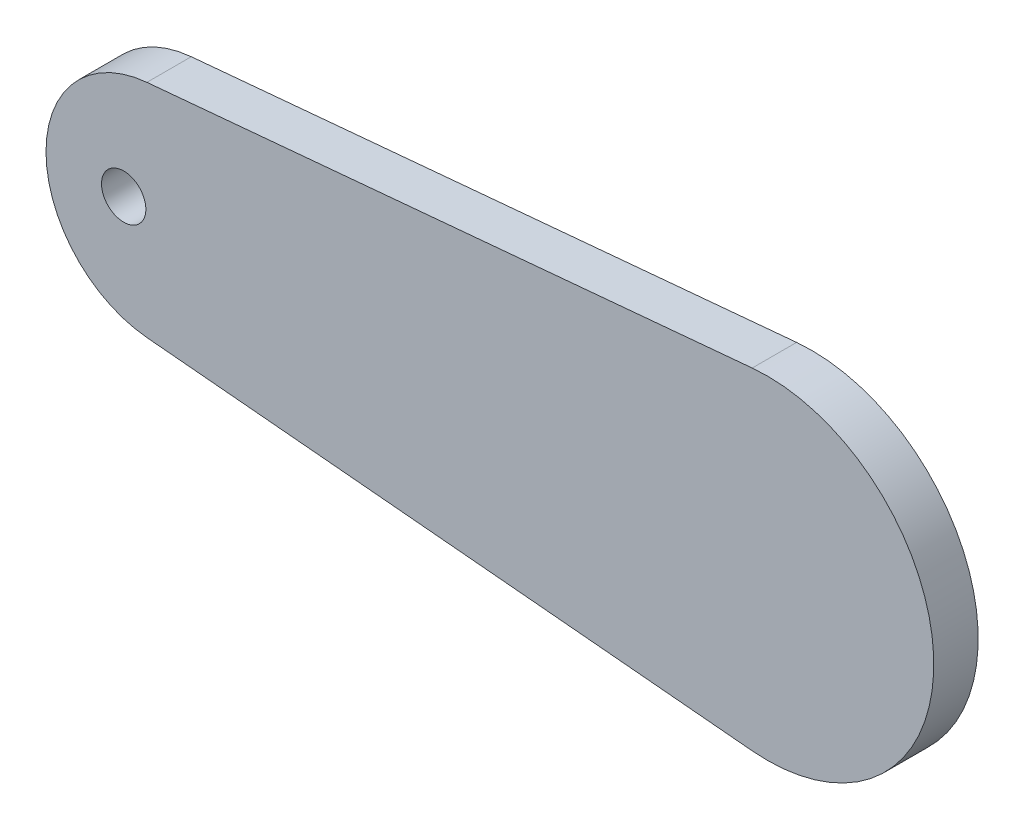
ISO-10303-21;
HEADER;
FILE_DESCRIPTION(('STEP AP214'),'2;1');
FILE_NAME('part.step','',(''),(''),'','','');
FILE_SCHEMA(('AUTOMOTIVE_DESIGN { 1 0 10303 214 1 1 1 1 }'));
ENDSEC;
DATA;
#1=APPLICATION_CONTEXT('core data for automotive mechanical design processes');
#2=APPLICATION_PROTOCOL_DEFINITION('international standard','automotive_design',2000,#1);
#3=PRODUCT_CONTEXT('',#1,'mechanical');
#4=PRODUCT('Part','Part','',(#3));
#5=PRODUCT_RELATED_PRODUCT_CATEGORY('part','',(#4));
#6=PRODUCT_DEFINITION_FORMATION('','',#4);
#7=PRODUCT_DEFINITION_CONTEXT('part definition',#1,'design');
#8=PRODUCT_DEFINITION('design','',#6,#7);
#9=PRODUCT_DEFINITION_SHAPE('','',#8);
#10=(LENGTH_UNIT() NAMED_UNIT(*) SI_UNIT(.MILLI.,.METRE.));
#11=(NAMED_UNIT(*) PLANE_ANGLE_UNIT() SI_UNIT($,.RADIAN.));
#12=(NAMED_UNIT(*) SI_UNIT($,.STERADIAN.) SOLID_ANGLE_UNIT());
#13=UNCERTAINTY_MEASURE_WITH_UNIT(LENGTH_MEASURE(1.E-05),#10,'distance_accuracy_value','');
#14=(GEOMETRIC_REPRESENTATION_CONTEXT(3) GLOBAL_UNCERTAINTY_ASSIGNED_CONTEXT((#13)) GLOBAL_UNIT_ASSIGNED_CONTEXT((#10,
#11,#12)) REPRESENTATION_CONTEXT('',''));
#15=CARTESIAN_POINT('',(0.,0.,0.));
#16=DIRECTION('',(0.,0.,1.));
#17=DIRECTION('',(1.,0.,0.));
#18=AXIS2_PLACEMENT_3D('',#15,#16,#17);
#19=CARTESIAN_POINT('',(0.,0.,4.));
#20=DIRECTION('',(0.,0.,1.));
#21=DIRECTION('',(1.,0.,0.));
#22=AXIS2_PLACEMENT_3D('',#19,#20,#21);
#23=PLANE('',#22);
#24=CARTESIAN_POINT('',(0.,0.,4.));
#25=DIRECTION('',(0.,0.,1.));
#26=DIRECTION('',(1.,0.,0.));
#27=AXIS2_PLACEMENT_3D('',#24,#25,#26);
#28=CIRCLE('',#27,10.);
#29=CARTESIAN_POINT('',(-0.909090909090907,9.95859195463938,4.));
#30=VERTEX_POINT('',#29);
#31=CARTESIAN_POINT('',(-0.909090909090907,-9.95859195463938,4.));
#32=VERTEX_POINT('',#31);
#33=EDGE_CURVE('E85',#30,#32,#28,.T.);
#34=ORIENTED_EDGE('',*,*,#33,.T.);
#35=DIRECTION('',(0.995859195463938,-0.090909090909091,0.));
#36=VECTOR('',#35,1.);
#37=CARTESIAN_POINT('',(-0.909090909090907,-9.95859195463938,4.));
#38=LINE('',#37,#36);
#39=CARTESIAN_POINT('',(53.6363636363636,-14.9378879319591,4.));
#40=VERTEX_POINT('',#39);
#41=EDGE_CURVE('E80',#32,#40,#38,.T.);
#42=ORIENTED_EDGE('',*,*,#41,.T.);
#43=CARTESIAN_POINT('',(55.,0.,4.));
#44=DIRECTION('',(0.,0.,1.));
#45=DIRECTION('',(-1.,0.,0.));
#46=AXIS2_PLACEMENT_3D('',#43,#44,#45);
#47=CIRCLE('',#46,15.);
#48=CARTESIAN_POINT('',(53.6363636363636,14.9378879319591,4.));
#49=VERTEX_POINT('',#48);
#50=EDGE_CURVE('E83',#40,#49,#47,.T.);
#51=ORIENTED_EDGE('',*,*,#50,.T.);
#52=DIRECTION('',(-0.995859195463938,-0.090909090909091,0.));
#53=VECTOR('',#52,1.);
#54=CARTESIAN_POINT('',(-0.909090909090907,9.95859195463938,4.));
#55=LINE('',#54,#53);
#56=EDGE_CURVE('E50',#49,#30,#55,.T.);
#57=ORIENTED_EDGE('',*,*,#56,.T.);
#58=EDGE_LOOP('',(#34,#42,#51,#57));
#59=FACE_BOUND('',#58,.T.);
#60=CARTESIAN_POINT('',(-3.,0.,4.));
#61=DIRECTION('',(0.,0.,1.));
#62=DIRECTION('',(1.,0.,0.));
#63=AXIS2_PLACEMENT_3D('',#60,#61,#62);
#64=CIRCLE('',#63,2.);
#65=CARTESIAN_POINT('',(-1.,0.,4.));
#66=VERTEX_POINT('',#65);
#67=EDGE_CURVE('E100',#66,#66,#64,.T.);
#68=ORIENTED_EDGE('',*,*,#67,.F.);
#69=EDGE_LOOP('',(#68));
#70=FACE_BOUND('',#69,.T.);
#71=ADVANCED_FACE('F33',(#59,#70),#23,.T.);
#72=CARTESIAN_POINT('',(0.,0.,0.));
#73=DIRECTION('',(0.,0.,1.));
#74=DIRECTION('',(1.,0.,0.));
#75=AXIS2_PLACEMENT_3D('',#72,#73,#74);
#76=PLANE('',#75);
#77=CARTESIAN_POINT('',(0.,0.,0.));
#78=DIRECTION('',(0.,0.,1.));
#79=DIRECTION('',(1.,0.,0.));
#80=AXIS2_PLACEMENT_3D('',#77,#78,#79);
#81=CIRCLE('',#80,10.);
#82=CARTESIAN_POINT('',(-0.909090909090907,9.95859195463938,0.));
#83=VERTEX_POINT('',#82);
#84=CARTESIAN_POINT('',(-0.909090909090907,-9.95859195463938,0.));
#85=VERTEX_POINT('',#84);
#86=EDGE_CURVE('E97',#83,#85,#81,.T.);
#87=ORIENTED_EDGE('',*,*,#86,.F.);
#88=DIRECTION('',(-0.995859195463938,-0.090909090909091,0.));
#89=VECTOR('',#88,1.);
#90=CARTESIAN_POINT('',(-0.909090909090907,9.95859195463938,0.));
#91=LINE('',#90,#89);
#92=CARTESIAN_POINT('',(53.6363636363636,14.9378879319591,0.));
#93=VERTEX_POINT('',#92);
#94=EDGE_CURVE('E73',#93,#83,#91,.T.);
#95=ORIENTED_EDGE('',*,*,#94,.F.);
#96=CARTESIAN_POINT('',(55.,0.,0.));
#97=DIRECTION('',(0.,0.,1.));
#98=DIRECTION('',(-1.,0.,0.));
#99=AXIS2_PLACEMENT_3D('',#96,#97,#98);
#100=CIRCLE('',#99,15.);
#101=CARTESIAN_POINT('',(53.6363636363636,-14.9378879319591,0.));
#102=VERTEX_POINT('',#101);
#103=EDGE_CURVE('E67',#102,#93,#100,.T.);
#104=ORIENTED_EDGE('',*,*,#103,.F.);
#105=DIRECTION('',(0.995859195463938,-0.090909090909091,0.));
#106=VECTOR('',#105,1.);
#107=CARTESIAN_POINT('',(-0.909090909090907,-9.95859195463938,0.));
#108=LINE('',#107,#106);
#109=EDGE_CURVE('E89',#85,#102,#108,.T.);
#110=ORIENTED_EDGE('',*,*,#109,.F.);
#111=EDGE_LOOP('',(#87,#95,#104,#110));
#112=FACE_BOUND('',#111,.T.);
#113=CARTESIAN_POINT('',(-3.,0.,0.));
#114=DIRECTION('',(0.,0.,1.));
#115=DIRECTION('',(1.,0.,0.));
#116=AXIS2_PLACEMENT_3D('',#113,#114,#115);
#117=CIRCLE('',#116,2.);
#118=CARTESIAN_POINT('',(-1.,0.,0.));
#119=VERTEX_POINT('',#118);
#120=EDGE_CURVE('E112',#119,#119,#117,.T.);
#121=ORIENTED_EDGE('',*,*,#120,.T.);
#122=EDGE_LOOP('',(#121));
#123=FACE_BOUND('',#122,.T.);
#124=ADVANCED_FACE('F108',(#112,#123),#76,.F.);
#125=CARTESIAN_POINT('',(0.,0.,4.));
#126=DIRECTION('',(0.,0.,-1.));
#127=DIRECTION('',(-1.,0.,0.));
#128=AXIS2_PLACEMENT_3D('',#125,#126,#127);
#129=CYLINDRICAL_SURFACE('',#128,10.);
#130=ORIENTED_EDGE('',*,*,#86,.T.);
#131=DIRECTION('',(0.,0.,-1.));
#132=VECTOR('',#131,1.);
#133=CARTESIAN_POINT('',(-0.909090909090907,-9.95859195463938,4.));
#134=LINE('',#133,#132);
#135=EDGE_CURVE('E11',#32,#85,#134,.T.);
#136=ORIENTED_EDGE('',*,*,#135,.F.);
#137=ORIENTED_EDGE('',*,*,#33,.F.);
#138=DIRECTION('',(0.,0.,-1.));
#139=VECTOR('',#138,1.);
#140=CARTESIAN_POINT('',(-0.909090909090907,9.95859195463938,4.));
#141=LINE('',#140,#139);
#142=EDGE_CURVE('E93',#30,#83,#141,.T.);
#143=ORIENTED_EDGE('',*,*,#142,.T.);
#144=EDGE_LOOP('',(#130,#136,#137,#143));
#145=FACE_BOUND('',#144,.T.);
#146=ADVANCED_FACE('F35',(#145),#129,.T.);
#147=CARTESIAN_POINT('',(-0.909090909090907,-9.95859195463938,4.));
#148=DIRECTION('',(0.090909090909091,0.995859195463938,0.));
#149=DIRECTION('',(-0.995859195463938,0.090909090909091,0.));
#150=AXIS2_PLACEMENT_3D('',#147,#148,#149);
#151=PLANE('',#150);
#152=ORIENTED_EDGE('',*,*,#109,.T.);
#153=DIRECTION('',(0.,0.,-1.));
#154=VECTOR('',#153,1.);
#155=CARTESIAN_POINT('',(53.6363636363636,-14.9378879319591,4.));
#156=LINE('',#155,#154);
#157=EDGE_CURVE('E42',#40,#102,#156,.T.);
#158=ORIENTED_EDGE('',*,*,#157,.F.);
#159=ORIENTED_EDGE('',*,*,#41,.F.);
#160=ORIENTED_EDGE('',*,*,#135,.T.);
#161=EDGE_LOOP('',(#152,#158,#159,#160));
#162=FACE_BOUND('',#161,.T.);
#163=ADVANCED_FACE('F88',(#162),#151,.F.);
#164=CARTESIAN_POINT('',(55.,0.,4.));
#165=DIRECTION('',(0.,0.,-1.));
#166=DIRECTION('',(-1.,0.,0.));
#167=AXIS2_PLACEMENT_3D('',#164,#165,#166);
#168=CYLINDRICAL_SURFACE('',#167,15.);
#169=ORIENTED_EDGE('',*,*,#103,.T.);
#170=DIRECTION('',(0.,0.,-1.));
#171=VECTOR('',#170,1.);
#172=CARTESIAN_POINT('',(53.6363636363636,14.9378879319591,4.));
#173=LINE('',#172,#171);
#174=EDGE_CURVE('E90',#49,#93,#173,.T.);
#175=ORIENTED_EDGE('',*,*,#174,.F.);
#176=ORIENTED_EDGE('',*,*,#50,.F.);
#177=ORIENTED_EDGE('',*,*,#157,.T.);
#178=EDGE_LOOP('',(#169,#175,#176,#177));
#179=FACE_BOUND('',#178,.T.);
#180=ADVANCED_FACE('F91',(#179),#168,.T.);
#181=CARTESIAN_POINT('',(-0.909090909090907,9.95859195463938,4.));
#182=DIRECTION('',(0.090909090909091,-0.995859195463938,0.));
#183=DIRECTION('',(0.995859195463938,0.090909090909091,0.));
#184=AXIS2_PLACEMENT_3D('',#181,#182,#183);
#185=PLANE('',#184);
#186=ORIENTED_EDGE('',*,*,#94,.T.);
#187=ORIENTED_EDGE('',*,*,#142,.F.);
#188=ORIENTED_EDGE('',*,*,#56,.F.);
#189=ORIENTED_EDGE('',*,*,#174,.T.);
#190=EDGE_LOOP('',(#186,#187,#188,#189));
#191=FACE_BOUND('',#190,.T.);
#192=ADVANCED_FACE('F105',(#191),#185,.F.);
#193=CARTESIAN_POINT('',(-3.,0.,4.));
#194=DIRECTION('',(0.,0.,-1.));
#195=DIRECTION('',(-1.,0.,0.));
#196=AXIS2_PLACEMENT_3D('',#193,#194,#195);
#197=CYLINDRICAL_SURFACE('',#196,2.);
#198=ORIENTED_EDGE('',*,*,#67,.T.);
#199=EDGE_LOOP('',(#198));
#200=FACE_BOUND('',#199,.T.);
#201=ORIENTED_EDGE('',*,*,#120,.F.);
#202=EDGE_LOOP('',(#201));
#203=FACE_BOUND('',#202,.T.);
#204=ADVANCED_FACE('F118',(#200,#203),#197,.F.);
#205=CLOSED_SHELL('',(#71,#124,#146,#163,#180,#192,#204));
#206=MANIFOLD_SOLID_BREP('B2',#205);
#207=ADVANCED_BREP_SHAPE_REPRESENTATION('',(#18,#206),#14);
#208=SHAPE_DEFINITION_REPRESENTATION(#9,#207);
ENDSEC;
END-ISO-10303-21;
